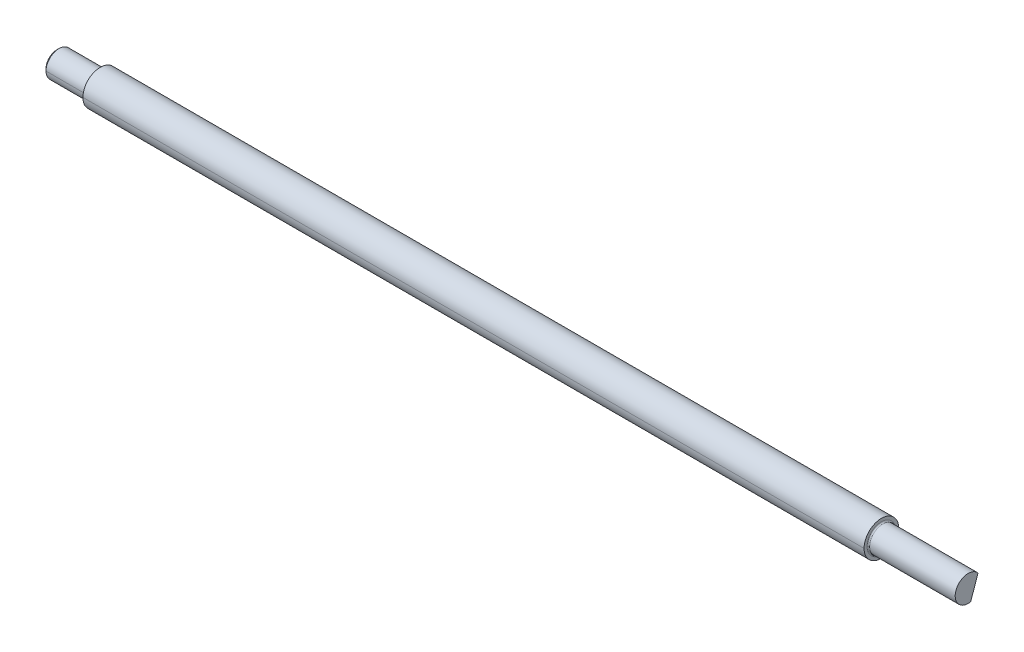
ISO-10303-21;
HEADER;
FILE_DESCRIPTION(('STEP AP214'),'2;1');
FILE_NAME('part.step','',(''),(''),'','','');
FILE_SCHEMA(('AUTOMOTIVE_DESIGN { 1 0 10303 214 1 1 1 1 }'));
ENDSEC;
DATA;
#1=APPLICATION_CONTEXT('core data for automotive mechanical design processes');
#2=APPLICATION_PROTOCOL_DEFINITION('international standard','automotive_design',2000,#1);
#3=PRODUCT_CONTEXT('',#1,'mechanical');
#4=PRODUCT('Part','Part','',(#3));
#5=PRODUCT_RELATED_PRODUCT_CATEGORY('part','',(#4));
#6=PRODUCT_DEFINITION_FORMATION('','',#4);
#7=PRODUCT_DEFINITION_CONTEXT('part definition',#1,'design');
#8=PRODUCT_DEFINITION('design','',#6,#7);
#9=PRODUCT_DEFINITION_SHAPE('','',#8);
#10=(LENGTH_UNIT() NAMED_UNIT(*) SI_UNIT(.MILLI.,.METRE.));
#11=(NAMED_UNIT(*) PLANE_ANGLE_UNIT() SI_UNIT($,.RADIAN.));
#12=(NAMED_UNIT(*) SI_UNIT($,.STERADIAN.) SOLID_ANGLE_UNIT());
#13=UNCERTAINTY_MEASURE_WITH_UNIT(LENGTH_MEASURE(1.E-05),#10,'distance_accuracy_value','');
#14=(GEOMETRIC_REPRESENTATION_CONTEXT(3) GLOBAL_UNCERTAINTY_ASSIGNED_CONTEXT((#13)) GLOBAL_UNIT_ASSIGNED_CONTEXT((#10,
#11,#12)) REPRESENTATION_CONTEXT('',''));
#15=CARTESIAN_POINT('',(0.,0.,0.));
#16=DIRECTION('',(0.,0.,1.));
#17=DIRECTION('',(1.,0.,0.));
#18=AXIS2_PLACEMENT_3D('',#15,#16,#17);
#19=CARTESIAN_POINT('',(200.,0.,0.));
#20=DIRECTION('',(-1.,0.,0.));
#21=DIRECTION('',(0.,-1.,0.));
#22=AXIS2_PLACEMENT_3D('',#19,#20,#21);
#23=CYLINDRICAL_SURFACE('',#22,3.);
#24=DIRECTION('',(1.,0.,0.));
#25=VECTOR('',#24,1.);
#26=CARTESIAN_POINT('',(202.,1.97576276272791,-2.2575122381546));
#27=LINE('',#26,#25);
#28=CARTESIAN_POINT('',(202.,1.97576276272791,-2.2575122381546));
#29=VERTEX_POINT('',#28);
#30=CARTESIAN_POINT('',(210.,1.97576276272791,-2.2575122381546));
#31=VERTEX_POINT('',#30);
#32=EDGE_CURVE('E57',#29,#31,#27,.T.);
#33=ORIENTED_EDGE('',*,*,#32,.F.);
#34=CARTESIAN_POINT('',(202.,0.,0.));
#35=DIRECTION('',(1.,0.,0.));
#36=DIRECTION('',(0.,0.,-1.));
#37=AXIS2_PLACEMENT_3D('',#34,#35,#36);
#38=CIRCLE('',#37,3.);
#39=CARTESIAN_POINT('',(202.,-2.94294432895997,-0.582304625297059));
#40=VERTEX_POINT('',#39);
#41=EDGE_CURVE('E131',#40,#29,#38,.T.);
#42=ORIENTED_EDGE('',*,*,#41,.F.);
#43=DIRECTION('',(1.,0.,0.));
#44=VECTOR('',#43,1.);
#45=CARTESIAN_POINT('',(202.,-2.94294432895997,-0.582304625297059));
#46=LINE('',#45,#44);
#47=CARTESIAN_POINT('',(210.,-2.94294432895997,-0.582304625297059));
#48=VERTEX_POINT('',#47);
#49=EDGE_CURVE('E121',#40,#48,#46,.T.);
#50=ORIENTED_EDGE('',*,*,#49,.T.);
#51=CARTESIAN_POINT('',(210.,0.,0.));
#52=DIRECTION('',(1.,0.,0.));
#53=DIRECTION('',(0.,0.,-1.));
#54=AXIS2_PLACEMENT_3D('',#51,#52,#53);
#55=CIRCLE('',#54,3.);
#56=EDGE_CURVE('E139',#31,#48,#55,.T.);
#57=ORIENTED_EDGE('',*,*,#56,.F.);
#58=EDGE_LOOP('',(#33,#42,#50,#57));
#59=FACE_BOUND('',#58,.T.);
#60=DIRECTION('',(-1.,0.,0.));
#61=VECTOR('',#60,1.);
#62=CARTESIAN_POINT('',(199.5,0.,3.));
#63=LINE('',#62,#61);
#64=CARTESIAN_POINT('',(198.,0.,3.));
#65=VERTEX_POINT('',#64);
#66=CARTESIAN_POINT('',(190.3,0.,3.));
#67=VERTEX_POINT('',#66);
#68=EDGE_CURVE('E43',#65,#67,#63,.T.);
#69=ORIENTED_EDGE('',*,*,#68,.F.);
#70=ORIENTED_EDGE('',*,*,#68,.T.);
#71=CARTESIAN_POINT('',(190.3,0.,0.));
#72=DIRECTION('',(1.,0.,0.));
#73=DIRECTION('',(0.,0.,-1.));
#74=AXIS2_PLACEMENT_3D('',#71,#72,#73);
#75=CIRCLE('',#74,3.);
#76=CARTESIAN_POINT('',(190.3,0.,-3.00000000000001));
#77=VERTEX_POINT('',#76);
#78=EDGE_CURVE('E12',#67,#77,#75,.T.);
#79=ORIENTED_EDGE('',*,*,#78,.T.);
#80=DIRECTION('',(-1.,0.,0.));
#81=VECTOR('',#80,1.);
#82=CARTESIAN_POINT('',(199.5,0.,-3.));
#83=LINE('',#82,#81);
#84=CARTESIAN_POINT('',(198.,0.,-3.));
#85=VERTEX_POINT('',#84);
#86=EDGE_CURVE('E49',#85,#77,#83,.T.);
#87=ORIENTED_EDGE('',*,*,#86,.F.);
#88=ORIENTED_EDGE('',*,*,#86,.T.);
#89=CARTESIAN_POINT('',(190.3,0.,0.));
#90=DIRECTION('',(1.,0.,0.));
#91=DIRECTION('',(0.,0.,-1.));
#92=AXIS2_PLACEMENT_3D('',#89,#90,#91);
#93=CIRCLE('',#92,3.);
#94=EDGE_CURVE('E193',#77,#67,#93,.T.);
#95=ORIENTED_EDGE('',*,*,#94,.T.);
#96=EDGE_LOOP('',(#69,#70,#79,#87,#88,#95));
#97=FACE_BOUND('',#96,.T.);
#98=ADVANCED_FACE('F40',(#59,#97),#23,.T.);
#99=CARTESIAN_POINT('',(190.299999999993,0.,0.));
#100=DIRECTION('',(1.,0.,0.));
#101=DIRECTION('',(0.,-1.,0.));
#102=AXIS2_PLACEMENT_3D('',#99,#100,#101);
#103=TOROIDAL_SURFACE('',#102,3.3,0.3);
#104=CARTESIAN_POINT('',(190.,0.,0.));
#105=DIRECTION('',(1.,0.,0.));
#106=DIRECTION('',(0.,0.,-1.));
#107=AXIS2_PLACEMENT_3D('',#104,#105,#106);
#108=CIRCLE('',#107,3.3);
#109=CARTESIAN_POINT('',(190.,0.,-3.3));
#110=VERTEX_POINT('',#109);
#111=CARTESIAN_POINT('',(189.999999999993,0.,3.3));
#112=VERTEX_POINT('',#111);
#113=EDGE_CURVE('E251',#110,#112,#108,.T.);
#114=ORIENTED_EDGE('',*,*,#113,.T.);
#115=CARTESIAN_POINT('',(190.3,0.,3.));
#116=CARTESIAN_POINT('',(190.295091256522,0.,2.99999989587325));
#117=CARTESIAN_POINT('',(190.290182521903,0.,3.00012047486223));
#118=CARTESIAN_POINT('',(190.2803768735,0.,3.000602251414));
#119=CARTESIAN_POINT('',(190.275479959714,0.,3.0009634489768));
#120=CARTESIAN_POINT('',(190.265709756087,0.,3.00192571501859));
#121=CARTESIAN_POINT('',(190.260836466246,0.,3.00252678349759));
#122=CARTESIAN_POINT('',(190.251125249079,0.,3.00396731052167));
#123=CARTESIAN_POINT('',(190.246287321752,0.,3.00480676906676));
#124=CARTESIAN_POINT('',(190.236658485036,0.,3.0067220626889));
#125=CARTESIAN_POINT('',(190.231867575647,0.,3.00779789776595));
#126=CARTESIAN_POINT('',(190.222344316409,0.,3.01018335031445));
#127=CARTESIAN_POINT('',(190.217611966561,0.,3.0114929677859));
#128=CARTESIAN_POINT('',(190.208217227083,0.,3.01434283077146));
#129=CARTESIAN_POINT('',(190.203554837453,0.,3.01588307628558));
#130=CARTESIAN_POINT('',(190.194311250508,0.,3.01919048460091));
#131=CARTESIAN_POINT('',(190.189730053192,0.,3.02095764740214));
#132=CARTESIAN_POINT('',(190.180659887384,0.,3.02471463308706));
#133=CARTESIAN_POINT('',(190.176170918891,0.,3.02670445597075));
#134=CARTESIAN_POINT('',(190.167296025046,0.,3.03090196815086));
#135=CARTESIAN_POINT('',(190.162910099693,0.,3.03310965744727));
#136=CARTESIAN_POINT('',(190.154251858206,0.,3.03773758393917));
#137=CARTESIAN_POINT('',(190.149979542072,0.,3.04015782113465));
#138=CARTESIAN_POINT('',(190.141558811406,0.,3.04520501286044));
#139=CARTESIAN_POINT('',(190.137410396874,0.,3.04783196739075));
#140=CARTESIAN_POINT('',(190.129247463307,0.,3.05328626522285));
#141=CARTESIAN_POINT('',(190.125232944272,0.,3.05611360852464));
#142=CARTESIAN_POINT('',(190.117347473025,0.,3.061961872582));
#143=CARTESIAN_POINT('',(190.113476520814,0.,3.06498279333757));
#144=CARTESIAN_POINT('',(190.10588750868,0.,3.07121093463978));
#145=CARTESIAN_POINT('',(190.102169448756,0.,3.07441815518642));
#146=CARTESIAN_POINT('',(190.094895178328,0.,3.08101116959559));
#147=CARTESIAN_POINT('',(190.091338967823,0.,3.0843969634581));
#148=CARTESIAN_POINT('',(190.084396963456,0.,3.09133896782501));
#149=CARTESIAN_POINT('',(190.081011169593,0.,3.09489517832941));
#150=CARTESIAN_POINT('',(190.074418155184,0.,3.1021694487575));
#151=CARTESIAN_POINT('',(190.071210934637,0.,3.1058875086812));
#152=CARTESIAN_POINT('',(190.064982793335,0.,3.11347652081586));
#153=CARTESIAN_POINT('',(190.061961872579,0.,3.11734747302683));
#154=CARTESIAN_POINT('',(190.056113608522,0.,3.12523294427312));
#155=CARTESIAN_POINT('',(190.05328626522,0.,3.12924746330844));
#156=CARTESIAN_POINT('',(190.047831967388,0.,3.13741039687542));
#157=CARTESIAN_POINT('',(190.045205012857,0.,3.1415588114071));
#158=CARTESIAN_POINT('',(190.040157821131,0.,3.14997954207283));
#159=CARTESIAN_POINT('',(190.037737583936,0.,3.15425185820689));
#160=CARTESIAN_POINT('',(190.033109657444,0.,3.16291009969365));
#161=CARTESIAN_POINT('',(190.030901968147,0.,3.16729602504635));
#162=CARTESIAN_POINT('',(190.026704455967,0.,3.17617091889191));
#163=CARTESIAN_POINT('',(190.024714633083,0.,3.18065988738476));
#164=CARTESIAN_POINT('',(190.020957647398,0.,3.18973005319294));
#165=CARTESIAN_POINT('',(190.019190484596,0.,3.19431125050825));
#166=CARTESIAN_POINT('',(190.015883076281,0.,3.20355483745352));
#167=CARTESIAN_POINT('',(190.014342830767,0.,3.20821722708347));
#168=CARTESIAN_POINT('',(190.011492967781,0.,3.21761196656133));
#169=CARTESIAN_POINT('',(190.010183350309,0.,3.22234431640923));
#170=CARTESIAN_POINT('',(190.007797897761,0.,3.23186757564668));
#171=CARTESIAN_POINT('',(190.006722062683,0.,3.23665848503622));
#172=CARTESIAN_POINT('',(190.004806769061,0.,3.24628732175237));
#173=CARTESIAN_POINT('',(190.003967310516,0.,3.25112524907898));
#174=CARTESIAN_POINT('',(190.002526783492,0.,3.2608364662465));
#175=CARTESIAN_POINT('',(190.001925715012,0.,3.26570975608741));
#176=CARTESIAN_POINT('',(190.00096344897,0.,3.27547995971398));
#177=CARTESIAN_POINT('',(190.000602251407,0.,3.28037687349963));
#178=CARTESIAN_POINT('',(190.000120474855,0.,3.29018252190347));
#179=CARTESIAN_POINT('',(189.999999895866,0.,3.29509125652166));
#180=CARTESIAN_POINT('',(189.999999999993,0.,3.3));
#181=B_SPLINE_CURVE_WITH_KNOTS('',3,(#115,#116,#117,#118,#119,#120,#121,#122,#123,#124,#125,
#126,#127,#128,#129,#130,#131,#132,#133,#134,#135,#136,#137,#138,#139,#140,#141,#142,#143,#144,
#145,#146,#147,#148,#149,#150,#151,#152,#153,#154,#155,#156,#157,#158,#159,#160,#161,#162,#163,
#164,#165,#166,#167,#168,#169,#170,#171,#172,#173,#174,#175,#176,#177,#178,#179,#180),
.UNSPECIFIED.,.F.,.F.,(4,2,2,2,2,2,2,2,2,2,2,2,2,2,2,2,2,2,2,2,2,2,2,2,2,2,2,2,2,2,2,2,4),(0.,
0.0147247371139736,0.0294494742279372,0.0441742113419071,0.0588989484558698,0.0736236855698409,
0.0883484226837944,0.103073159797769,0.117797896911725,0.132522634025707,0.147247371139659,
0.161972108253644,0.1766968453676,0.191421582481565,0.20614631959554,0.220871056709509,
0.235595793823459,0.250320530937427,0.265045268051405,0.279770005165375,0.294494742279338,
0.309219479393307,0.323944216507266,0.338668953621236,0.353393690735201,0.368118427849168,
0.382843164963138,0.397567902077105,0.412292639191072,0.427017376305037,0.441742113419003,
0.456466850532971,0.471191587646937),.UNSPECIFIED.);
#182=EDGE_CURVE('E255',#67,#112,#181,.T.);
#183=ORIENTED_EDGE('',*,*,#182,.F.);
#184=ORIENTED_EDGE('',*,*,#94,.F.);
#185=CARTESIAN_POINT('',(190.3,0.,-3.));
#186=CARTESIAN_POINT('',(190.295091256522,0.,-2.99999989587325));
#187=CARTESIAN_POINT('',(190.290182521903,0.,-3.00012047486223));
#188=CARTESIAN_POINT('',(190.2803768735,0.,-3.000602251414));
#189=CARTESIAN_POINT('',(190.275479959714,0.,-3.0009634489768));
#190=CARTESIAN_POINT('',(190.265709756087,0.,-3.00192571501859));
#191=CARTESIAN_POINT('',(190.260836466246,0.,-3.00252678349759));
#192=CARTESIAN_POINT('',(190.251125249079,0.,-3.00396731052167));
#193=CARTESIAN_POINT('',(190.246287321752,0.,-3.00480676906676));
#194=CARTESIAN_POINT('',(190.236658485036,0.,-3.0067220626889));
#195=CARTESIAN_POINT('',(190.231867575647,0.,-3.00779789776595));
#196=CARTESIAN_POINT('',(190.222344316409,0.,-3.01018335031445));
#197=CARTESIAN_POINT('',(190.217611966561,0.,-3.0114929677859));
#198=CARTESIAN_POINT('',(190.208217227083,0.,-3.01434283077146));
#199=CARTESIAN_POINT('',(190.203554837453,0.,-3.01588307628558));
#200=CARTESIAN_POINT('',(190.194311250508,0.,-3.01919048460091));
#201=CARTESIAN_POINT('',(190.189730053192,0.,-3.02095764740214));
#202=CARTESIAN_POINT('',(190.180659887384,0.,-3.02471463308706));
#203=CARTESIAN_POINT('',(190.176170918891,0.,-3.02670445597075));
#204=CARTESIAN_POINT('',(190.167296025046,0.,-3.03090196815086));
#205=CARTESIAN_POINT('',(190.162910099693,0.,-3.03310965744727));
#206=CARTESIAN_POINT('',(190.154251858206,0.,-3.03773758393917));
#207=CARTESIAN_POINT('',(190.149979542072,0.,-3.04015782113465));
#208=CARTESIAN_POINT('',(190.141558811406,0.,-3.04520501286044));
#209=CARTESIAN_POINT('',(190.137410396874,0.,-3.04783196739075));
#210=CARTESIAN_POINT('',(190.129247463307,0.,-3.05328626522285));
#211=CARTESIAN_POINT('',(190.125232944272,0.,-3.05611360852464));
#212=CARTESIAN_POINT('',(190.117347473025,0.,-3.061961872582));
#213=CARTESIAN_POINT('',(190.113476520814,0.,-3.06498279333757));
#214=CARTESIAN_POINT('',(190.10588750868,0.,-3.07121093463978));
#215=CARTESIAN_POINT('',(190.102169448756,0.,-3.07441815518643));
#216=CARTESIAN_POINT('',(190.094895178328,0.,-3.08101116959559));
#217=CARTESIAN_POINT('',(190.091338967823,0.,-3.0843969634581));
#218=CARTESIAN_POINT('',(190.084396963456,0.,-3.09133896782501));
#219=CARTESIAN_POINT('',(190.081011169593,0.,-3.09489517832941));
#220=CARTESIAN_POINT('',(190.074418155184,0.,-3.1021694487575));
#221=CARTESIAN_POINT('',(190.071210934637,0.,-3.1058875086812));
#222=CARTESIAN_POINT('',(190.064982793335,0.,-3.11347652081586));
#223=CARTESIAN_POINT('',(190.061961872579,0.,-3.11734747302683));
#224=CARTESIAN_POINT('',(190.056113608522,0.,-3.12523294427312));
#225=CARTESIAN_POINT('',(190.05328626522,0.,-3.12924746330844));
#226=CARTESIAN_POINT('',(190.047831967388,0.,-3.13741039687542));
#227=CARTESIAN_POINT('',(190.045205012857,0.,-3.1415588114071));
#228=CARTESIAN_POINT('',(190.040157821131,0.,-3.14997954207283));
#229=CARTESIAN_POINT('',(190.037737583936,0.,-3.15425185820689));
#230=CARTESIAN_POINT('',(190.033109657444,0.,-3.16291009969365));
#231=CARTESIAN_POINT('',(190.030901968147,0.,-3.16729602504635));
#232=CARTESIAN_POINT('',(190.026704455967,0.,-3.17617091889191));
#233=CARTESIAN_POINT('',(190.024714633083,0.,-3.18065988738477));
#234=CARTESIAN_POINT('',(190.020957647398,0.,-3.18973005319294));
#235=CARTESIAN_POINT('',(190.019190484596,0.,-3.19431125050825));
#236=CARTESIAN_POINT('',(190.015883076281,0.,-3.20355483745352));
#237=CARTESIAN_POINT('',(190.014342830767,0.,-3.20821722708347));
#238=CARTESIAN_POINT('',(190.011492967781,0.,-3.21761196656133));
#239=CARTESIAN_POINT('',(190.010183350309,0.,-3.22234431640923));
#240=CARTESIAN_POINT('',(190.007797897761,0.,-3.23186757564668));
#241=CARTESIAN_POINT('',(190.006722062683,0.,-3.23665848503622));
#242=CARTESIAN_POINT('',(190.004806769061,0.,-3.24628732175238));
#243=CARTESIAN_POINT('',(190.003967310516,0.,-3.25112524907898));
#244=CARTESIAN_POINT('',(190.002526783492,0.,-3.2608364662465));
#245=CARTESIAN_POINT('',(190.001925715012,0.,-3.26570975608741));
#246=CARTESIAN_POINT('',(190.00096344897,0.,-3.27547995971398));
#247=CARTESIAN_POINT('',(190.000602251407,0.,-3.28037687349963));
#248=CARTESIAN_POINT('',(190.000120474855,0.,-3.29018252190347));
#249=CARTESIAN_POINT('',(189.999999895866,0.,-3.29509125652166));
#250=CARTESIAN_POINT('',(189.999999999993,0.,-3.3));
#251=B_SPLINE_CURVE_WITH_KNOTS('',3,(#185,#186,#187,#188,#189,#190,#191,#192,#193,#194,#195,
#196,#197,#198,#199,#200,#201,#202,#203,#204,#205,#206,#207,#208,#209,#210,#211,#212,#213,#214,
#215,#216,#217,#218,#219,#220,#221,#222,#223,#224,#225,#226,#227,#228,#229,#230,#231,#232,#233,
#234,#235,#236,#237,#238,#239,#240,#241,#242,#243,#244,#245,#246,#247,#248,#249,#250),
.UNSPECIFIED.,.F.,.F.,(4,2,2,2,2,2,2,2,2,2,2,2,2,2,2,2,2,2,2,2,2,2,2,2,2,2,2,2,2,2,2,2,4),(0.,
0.0147247371139736,0.0294494742279372,0.0441742113419071,0.0588989484558698,0.0736236855698409,
0.0883484226837944,0.103073159797769,0.117797896911725,0.132522634025707,0.147247371139659,
0.161972108253645,0.1766968453676,0.191421582481565,0.20614631959554,0.220871056709509,
0.235595793823459,0.250320530937428,0.265045268051405,0.279770005165376,0.294494742279338,
0.309219479393307,0.323944216507267,0.338668953621237,0.353393690735201,0.368118427849168,
0.382843164963138,0.397567902077106,0.412292639191073,0.427017376305037,0.441742113419003,
0.456466850532972,0.471191587646938),.UNSPECIFIED.);
#252=EDGE_CURVE('E303',#77,#110,#251,.T.);
#253=ORIENTED_EDGE('',*,*,#252,.T.);
#254=EDGE_LOOP('',(#114,#183,#184,#253));
#255=FACE_BOUND('',#254,.T.);
#256=ADVANCED_FACE('F266',(#255),#103,.F.);
#257=CARTESIAN_POINT('',(190.299999999993,0.,0.));
#258=DIRECTION('',(1.,0.,0.));
#259=DIRECTION('',(0.,1.,0.));
#260=AXIS2_PLACEMENT_3D('',#257,#258,#259);
#261=TOROIDAL_SURFACE('',#260,3.3,0.3);
#262=ORIENTED_EDGE('',*,*,#78,.F.);
#263=ORIENTED_EDGE('',*,*,#182,.T.);
#264=CARTESIAN_POINT('',(190.,0.,0.));
#265=DIRECTION('',(1.,0.,0.));
#266=DIRECTION('',(0.,0.,-1.));
#267=AXIS2_PLACEMENT_3D('',#264,#265,#266);
#268=CIRCLE('',#267,3.3);
#269=EDGE_CURVE('E301',#112,#110,#268,.T.);
#270=ORIENTED_EDGE('',*,*,#269,.T.);
#271=ORIENTED_EDGE('',*,*,#252,.F.);
#272=EDGE_LOOP('',(#262,#263,#270,#271));
#273=FACE_BOUND('',#272,.T.);
#274=ADVANCED_FACE('F275',(#273),#261,.F.);
#275=CARTESIAN_POINT('',(190.,4.,0.));
#276=DIRECTION('',(-1.,0.,0.));
#277=DIRECTION('',(0.,0.,1.));
#278=AXIS2_PLACEMENT_3D('',#275,#276,#277);
#279=PLANE('',#278);
#280=ORIENTED_EDGE('',*,*,#113,.F.);
#281=ORIENTED_EDGE('',*,*,#269,.F.);
#282=EDGE_LOOP('',(#280,#281));
#283=FACE_BOUND('',#282,.T.);
#284=CARTESIAN_POINT('',(190.,0.,0.));
#285=DIRECTION('',(1.,0.,0.));
#286=DIRECTION('',(0.,0.,-1.));
#287=AXIS2_PLACEMENT_3D('',#284,#285,#286);
#288=CIRCLE('',#287,4.);
#289=CARTESIAN_POINT('',(190.,0.,-4.));
#290=VERTEX_POINT('',#289);
#291=CARTESIAN_POINT('',(190.,0.,4.));
#292=VERTEX_POINT('',#291);
#293=EDGE_CURVE('E304',#290,#292,#288,.T.);
#294=ORIENTED_EDGE('',*,*,#293,.T.);
#295=CARTESIAN_POINT('',(190.,0.,0.));
#296=DIRECTION('',(1.,0.,0.));
#297=DIRECTION('',(0.,0.,-1.));
#298=AXIS2_PLACEMENT_3D('',#295,#296,#297);
#299=CIRCLE('',#298,4.);
#300=EDGE_CURVE('E350',#292,#290,#299,.T.);
#301=ORIENTED_EDGE('',*,*,#300,.T.);
#302=EDGE_LOOP('',(#294,#301));
#303=FACE_BOUND('',#302,.T.);
#304=ADVANCED_FACE('F604',(#283,#303),#279,.F.);
#305=CARTESIAN_POINT('',(190.,0.,0.));
#306=DIRECTION('',(-1.,0.,0.));
#307=DIRECTION('',(0.,1.,0.));
#308=AXIS2_PLACEMENT_3D('',#305,#306,#307);
#309=CYLINDRICAL_SURFACE('',#308,4.);
#310=CARTESIAN_POINT('',(10.,0.,0.));
#311=DIRECTION('',(1.,0.,0.));
#312=DIRECTION('',(0.,0.,-1.));
#313=AXIS2_PLACEMENT_3D('',#310,#311,#312);
#314=CIRCLE('',#313,4.);
#315=CARTESIAN_POINT('',(10.,0.,4.));
#316=VERTEX_POINT('',#315);
#317=CARTESIAN_POINT('',(10.,0.,-4.));
#318=VERTEX_POINT('',#317);
#319=EDGE_CURVE('E360',#316,#318,#314,.T.);
#320=ORIENTED_EDGE('',*,*,#319,.T.);
#321=DIRECTION('',(-1.,0.,0.));
#322=VECTOR('',#321,1.);
#323=CARTESIAN_POINT('',(190.,0.,-4.));
#324=LINE('',#323,#322);
#325=EDGE_CURVE('E340',#290,#318,#324,.T.);
#326=ORIENTED_EDGE('',*,*,#325,.F.);
#327=ORIENTED_EDGE('',*,*,#300,.F.);
#328=DIRECTION('',(-1.,0.,0.));
#329=VECTOR('',#328,1.);
#330=CARTESIAN_POINT('',(190.,0.,4.));
#331=LINE('',#330,#329);
#332=EDGE_CURVE('E331',#292,#316,#331,.T.);
#333=ORIENTED_EDGE('',*,*,#332,.T.);
#334=EDGE_LOOP('',(#320,#326,#327,#333));
#335=FACE_BOUND('',#334,.T.);
#336=ADVANCED_FACE('F594',(#335),#309,.T.);
#337=CARTESIAN_POINT('',(190.,0.,0.));
#338=DIRECTION('',(-1.,0.,0.));
#339=DIRECTION('',(0.,-1.,0.));
#340=AXIS2_PLACEMENT_3D('',#337,#338,#339);
#341=CYLINDRICAL_SURFACE('',#340,4.);
#342=ORIENTED_EDGE('',*,*,#293,.F.);
#343=ORIENTED_EDGE('',*,*,#325,.T.);
#344=CARTESIAN_POINT('',(10.,0.,0.));
#345=DIRECTION('',(1.,0.,0.));
#346=DIRECTION('',(0.,0.,-1.));
#347=AXIS2_PLACEMENT_3D('',#344,#345,#346);
#348=CIRCLE('',#347,4.);
#349=EDGE_CURVE('E329',#318,#316,#348,.T.);
#350=ORIENTED_EDGE('',*,*,#349,.T.);
#351=ORIENTED_EDGE('',*,*,#332,.F.);
#352=EDGE_LOOP('',(#342,#343,#350,#351));
#353=FACE_BOUND('',#352,.T.);
#354=ADVANCED_FACE('F584',(#353),#341,.T.);
#355=CARTESIAN_POINT('',(10.,0.,0.));
#356=DIRECTION('',(1.,0.,0.));
#357=DIRECTION('',(0.,0.,-1.));
#358=AXIS2_PLACEMENT_3D('',#355,#356,#357);
#359=PLANE('',#358);
#360=ORIENTED_EDGE('',*,*,#349,.F.);
#361=ORIENTED_EDGE('',*,*,#319,.F.);
#362=EDGE_LOOP('',(#360,#361));
#363=FACE_BOUND('',#362,.T.);
#364=CARTESIAN_POINT('',(10.,0.,0.));
#365=DIRECTION('',(1.,0.,0.));
#366=DIRECTION('',(0.,0.,-1.));
#367=AXIS2_PLACEMENT_3D('',#364,#365,#366);
#368=CIRCLE('',#367,3.3);
#369=CARTESIAN_POINT('',(10.,0.,-3.3));
#370=VERTEX_POINT('',#369);
#371=CARTESIAN_POINT('',(10.0000000000001,0.,3.3));
#372=VERTEX_POINT('',#371);
#373=EDGE_CURVE('E416',#370,#372,#368,.T.);
#374=ORIENTED_EDGE('',*,*,#373,.T.);
#375=CARTESIAN_POINT('',(10.,0.,0.));
#376=DIRECTION('',(1.,0.,0.));
#377=DIRECTION('',(0.,0.,-1.));
#378=AXIS2_PLACEMENT_3D('',#375,#376,#377);
#379=CIRCLE('',#378,3.3);
#380=EDGE_CURVE('E415',#372,#370,#379,.T.);
#381=ORIENTED_EDGE('',*,*,#380,.T.);
#382=EDGE_LOOP('',(#374,#381));
#383=FACE_BOUND('',#382,.T.);
#384=ADVANCED_FACE('F394',(#363,#383),#359,.F.);
#385=CARTESIAN_POINT('',(9.70000000000012,0.,0.));
#386=DIRECTION('',(1.,0.,0.));
#387=DIRECTION('',(0.,1.,0.));
#388=AXIS2_PLACEMENT_3D('',#385,#386,#387);
#389=TOROIDAL_SURFACE('',#388,3.3,0.3);
#390=ORIENTED_EDGE('',*,*,#380,.F.);
#391=CARTESIAN_POINT('',(10.0000000000001,0.,3.3));
#392=CARTESIAN_POINT('',(10.0000001041268,0.,3.29509125652173));
#393=CARTESIAN_POINT('',(9.99987952513766,0.,3.29018252190362));
#394=CARTESIAN_POINT('',(9.99939774858568,0.,3.28037687349992));
#395=CARTESIAN_POINT('',(9.99903655102278,0.,3.27547995971434));
#396=CARTESIAN_POINT('',(9.99807428498078,0.,3.26570975608791));
#397=CARTESIAN_POINT('',(9.99747321650169,0.,3.26083646624707));
#398=CARTESIAN_POINT('',(9.99603268947742,0.,3.25112524907969));
#399=CARTESIAN_POINT('',(9.99519323093224,0.,3.24628732175315));
#400=CARTESIAN_POINT('',(9.99327793730993,0.,3.23665848503714));
#401=CARTESIAN_POINT('',(9.9922021022328,0.,3.23186757564766));
#402=CARTESIAN_POINT('',(9.98981664968415,0.,3.22234431641034));
#403=CARTESIAN_POINT('',(9.98850703221263,0.,3.2176119665625));
#404=CARTESIAN_POINT('',(9.98565716922692,0.,3.20821722708477));
#405=CARTESIAN_POINT('',(9.98411692371275,0.,3.20355483745488));
#406=CARTESIAN_POINT('',(9.98080951539729,0.,3.19431125050973));
#407=CARTESIAN_POINT('',(9.97904235259601,0.,3.18973005319448));
#408=CARTESIAN_POINT('',(9.97528536691098,0.,3.18065988738641));
#409=CARTESIAN_POINT('',(9.97329554402724,0.,3.17617091889361));
#410=CARTESIAN_POINT('',(9.96909803184704,0.,3.16729602504816));
#411=CARTESIAN_POINT('',(9.96689034255059,0.,3.1629100996955));
#412=CARTESIAN_POINT('',(9.96226241605862,0.,3.15425185820883));
#413=CARTESIAN_POINT('',(9.95984217886311,0.,3.14997954207482));
#414=CARTESIAN_POINT('',(9.95479498713726,0.,3.14155881140917));
#415=CARTESIAN_POINT('',(9.95216803260693,0.,3.13741039687754));
#416=CARTESIAN_POINT('',(9.94671373477479,0.,3.12924746331062));
#417=CARTESIAN_POINT('',(9.94388639147298,0.,3.12523294427534));
#418=CARTESIAN_POINT('',(9.93803812741559,0.,3.11734747302912));
#419=CARTESIAN_POINT('',(9.93501720666002,0.,3.11347652081817));
#420=CARTESIAN_POINT('',(9.9287890653578,0.,3.10588750868356));
#421=CARTESIAN_POINT('',(9.92558184481114,0.,3.10216944875988));
#422=CARTESIAN_POINT('',(9.91898883040199,0.,3.09489517833182));
#423=CARTESIAN_POINT('',(9.91560303653949,0.,3.09133896782744));
#424=CARTESIAN_POINT('',(9.9086610321726,0.,3.08439696346055));
#425=CARTESIAN_POINT('',(9.90510482166821,0.,3.08101116959805));
#426=CARTESIAN_POINT('',(9.89783055124015,0.,3.07441815518889));
#427=CARTESIAN_POINT('',(9.89411249131647,0.,3.07121093464225));
#428=CARTESIAN_POINT('',(9.88652347918185,0.,3.06498279334003));
#429=CARTESIAN_POINT('',(9.88265252697091,0.,3.06196187258445));
#430=CARTESIAN_POINT('',(9.87476705572468,0.,3.05611360852707));
#431=CARTESIAN_POINT('',(9.8707525366894,0.,3.05328626522526));
#432=CARTESIAN_POINT('',(9.86258960312248,0.,3.04783196739313));
#433=CARTESIAN_POINT('',(9.85844118859084,0.,3.0452050128628));
#434=CARTESIAN_POINT('',(9.85002045792519,0.,3.04015782113696));
#435=CARTESIAN_POINT('',(9.84574814179118,0.,3.03773758394144));
#436=CARTESIAN_POINT('',(9.83708990030451,0.,3.03310965744947));
#437=CARTESIAN_POINT('',(9.83270397495185,0.,3.03090196815302));
#438=CARTESIAN_POINT('',(9.8238290811064,0.,3.02670445597283));
#439=CARTESIAN_POINT('',(9.81934011261359,0.,3.02471463308909));
#440=CARTESIAN_POINT('',(9.81026994680553,0.,3.02095764740407));
#441=CARTESIAN_POINT('',(9.80568874949027,0.,3.01919048460279));
#442=CARTESIAN_POINT('',(9.79644516254512,0.,3.01588307628733));
#443=CARTESIAN_POINT('',(9.79178277291523,0.,3.01434283077316));
#444=CARTESIAN_POINT('',(9.7823880334375,0.,3.01149296778746));
#445=CARTESIAN_POINT('',(9.77765568358966,0.,3.01018335031594));
#446=CARTESIAN_POINT('',(9.76813242435234,0.,3.00779789776729));
#447=CARTESIAN_POINT('',(9.76334151496286,0.,3.00672206269016));
#448=CARTESIAN_POINT('',(9.75371267824685,0.,3.00480676906786));
#449=CARTESIAN_POINT('',(9.74887475092031,0.,3.00396731052268));
#450=CARTESIAN_POINT('',(9.73916353375293,0.,3.00252678349842));
#451=CARTESIAN_POINT('',(9.73429024391209,0.,3.00192571501933));
#452=CARTESIAN_POINT('',(9.72452004028566,0.,3.00096344897733));
#453=CARTESIAN_POINT('',(9.71962312650008,0.,3.00060225141443));
#454=CARTESIAN_POINT('',(9.70981747809638,0.,3.00012047486245));
#455=CARTESIAN_POINT('',(9.70490874347827,0.,2.99999989587337));
#456=CARTESIAN_POINT('',(9.7,0.,3.));
#457=B_SPLINE_CURVE_WITH_KNOTS('',3,(#391,#392,#393,#394,#395,#396,#397,#398,#399,#400,#401,
#402,#403,#404,#405,#406,#407,#408,#409,#410,#411,#412,#413,#414,#415,#416,#417,#418,#419,#420,
#421,#422,#423,#424,#425,#426,#427,#428,#429,#430,#431,#432,#433,#434,#435,#436,#437,#438,#439,
#440,#441,#442,#443,#444,#445,#446,#447,#448,#449,#450,#451,#452,#453,#454,#455,#456),
.UNSPECIFIED.,.F.,.F.,(4,2,2,2,2,2,2,2,2,2,2,2,2,2,2,2,2,2,2,2,2,2,2,2,2,2,2,2,2,2,2,2,4),(0.,
0.0147247371137512,0.0294494742275024,0.0441742113412533,0.0588989484550045,0.0736236855687557,
0.088348422682507,0.103073159796258,0.117797896910009,0.13252263402376,0.147247371137511,
0.161972108251262,0.176696845365013,0.191421582478764,0.206146319592516,0.220871056706268,
0.235595793820018,0.25032053093377,0.26504526804752,0.279770005161271,0.294494742275023,
0.309219479388774,0.323944216502524,0.338668953616276,0.353393690730028,0.368118427843777,
0.382843164957529,0.39756790207128,0.412292639185031,0.427017376298783,0.441742113412533,
0.456466850526284,0.471191587640035),.UNSPECIFIED.);
#458=CARTESIAN_POINT('',(9.7,0.,3.));
#459=VERTEX_POINT('',#458);
#460=EDGE_CURVE('E413',#372,#459,#457,.T.);
#461=ORIENTED_EDGE('',*,*,#460,.T.);
#462=CARTESIAN_POINT('',(9.7,0.,0.));
#463=DIRECTION('',(1.,0.,0.));
#464=DIRECTION('',(0.,0.,-1.));
#465=AXIS2_PLACEMENT_3D('',#462,#463,#464);
#466=CIRCLE('',#465,3.);
#467=CARTESIAN_POINT('',(9.7,0.,-3.));
#468=VERTEX_POINT('',#467);
#469=EDGE_CURVE('E654',#459,#468,#466,.T.);
#470=ORIENTED_EDGE('',*,*,#469,.T.);
#471=CARTESIAN_POINT('',(10.0000000000001,0.,-3.3));
#472=CARTESIAN_POINT('',(10.0000001041268,0.,-3.29509125652173));
#473=CARTESIAN_POINT('',(9.99987952513766,0.,-3.29018252190362));
#474=CARTESIAN_POINT('',(9.99939774858568,0.,-3.28037687349992));
#475=CARTESIAN_POINT('',(9.99903655102278,0.,-3.27547995971434));
#476=CARTESIAN_POINT('',(9.99807428498078,0.,-3.26570975608791));
#477=CARTESIAN_POINT('',(9.99747321650169,0.,-3.26083646624707));
#478=CARTESIAN_POINT('',(9.99603268947742,0.,-3.25112524907969));
#479=CARTESIAN_POINT('',(9.99519323093224,0.,-3.24628732175315));
#480=CARTESIAN_POINT('',(9.99327793730993,0.,-3.23665848503714));
#481=CARTESIAN_POINT('',(9.9922021022328,0.,-3.23186757564766));
#482=CARTESIAN_POINT('',(9.98981664968415,0.,-3.22234431641034));
#483=CARTESIAN_POINT('',(9.98850703221263,0.,-3.2176119665625));
#484=CARTESIAN_POINT('',(9.98565716922692,0.,-3.20821722708477));
#485=CARTESIAN_POINT('',(9.98411692371275,0.,-3.20355483745488));
#486=CARTESIAN_POINT('',(9.98080951539729,0.,-3.19431125050973));
#487=CARTESIAN_POINT('',(9.97904235259601,0.,-3.18973005319448));
#488=CARTESIAN_POINT('',(9.97528536691098,0.,-3.18065988738641));
#489=CARTESIAN_POINT('',(9.97329554402724,0.,-3.17617091889361));
#490=CARTESIAN_POINT('',(9.96909803184704,0.,-3.16729602504816));
#491=CARTESIAN_POINT('',(9.96689034255059,0.,-3.1629100996955));
#492=CARTESIAN_POINT('',(9.96226241605862,0.,-3.15425185820883));
#493=CARTESIAN_POINT('',(9.95984217886311,0.,-3.14997954207482));
#494=CARTESIAN_POINT('',(9.95479498713726,0.,-3.14155881140917));
#495=CARTESIAN_POINT('',(9.95216803260693,0.,-3.13741039687754));
#496=CARTESIAN_POINT('',(9.94671373477479,0.,-3.12924746331062));
#497=CARTESIAN_POINT('',(9.94388639147298,0.,-3.12523294427534));
#498=CARTESIAN_POINT('',(9.93803812741559,0.,-3.11734747302912));
#499=CARTESIAN_POINT('',(9.93501720666002,0.,-3.11347652081817));
#500=CARTESIAN_POINT('',(9.9287890653578,0.,-3.10588750868356));
#501=CARTESIAN_POINT('',(9.92558184481114,0.,-3.10216944875988));
#502=CARTESIAN_POINT('',(9.91898883040199,0.,-3.09489517833182));
#503=CARTESIAN_POINT('',(9.91560303653949,0.,-3.09133896782744));
#504=CARTESIAN_POINT('',(9.9086610321726,0.,-3.08439696346055));
#505=CARTESIAN_POINT('',(9.90510482166821,0.,-3.08101116959805));
#506=CARTESIAN_POINT('',(9.89783055124015,0.,-3.07441815518889));
#507=CARTESIAN_POINT('',(9.89411249131647,0.,-3.07121093464225));
#508=CARTESIAN_POINT('',(9.88652347918185,0.,-3.06498279334003));
#509=CARTESIAN_POINT('',(9.88265252697091,0.,-3.06196187258445));
#510=CARTESIAN_POINT('',(9.87476705572468,0.,-3.05611360852707));
#511=CARTESIAN_POINT('',(9.8707525366894,0.,-3.05328626522526));
#512=CARTESIAN_POINT('',(9.86258960312248,0.,-3.04783196739313));
#513=CARTESIAN_POINT('',(9.85844118859084,0.,-3.0452050128628));
#514=CARTESIAN_POINT('',(9.85002045792519,0.,-3.04015782113696));
#515=CARTESIAN_POINT('',(9.84574814179118,0.,-3.03773758394144));
#516=CARTESIAN_POINT('',(9.83708990030451,0.,-3.03310965744947));
#517=CARTESIAN_POINT('',(9.83270397495185,0.,-3.03090196815302));
#518=CARTESIAN_POINT('',(9.8238290811064,0.,-3.02670445597283));
#519=CARTESIAN_POINT('',(9.81934011261359,0.,-3.02471463308909));
#520=CARTESIAN_POINT('',(9.81026994680553,0.,-3.02095764740407));
#521=CARTESIAN_POINT('',(9.80568874949027,0.,-3.01919048460279));
#522=CARTESIAN_POINT('',(9.79644516254512,0.,-3.01588307628733));
#523=CARTESIAN_POINT('',(9.79178277291523,0.,-3.01434283077316));
#524=CARTESIAN_POINT('',(9.7823880334375,0.,-3.01149296778746));
#525=CARTESIAN_POINT('',(9.77765568358966,0.,-3.01018335031594));
#526=CARTESIAN_POINT('',(9.76813242435234,0.,-3.00779789776729));
#527=CARTESIAN_POINT('',(9.76334151496286,0.,-3.00672206269016));
#528=CARTESIAN_POINT('',(9.75371267824685,0.,-3.00480676906786));
#529=CARTESIAN_POINT('',(9.74887475092031,0.,-3.00396731052268));
#530=CARTESIAN_POINT('',(9.73916353375293,0.,-3.00252678349842));
#531=CARTESIAN_POINT('',(9.73429024391209,0.,-3.00192571501933));
#532=CARTESIAN_POINT('',(9.72452004028566,0.,-3.00096344897733));
#533=CARTESIAN_POINT('',(9.71962312650008,0.,-3.00060225141443));
#534=CARTESIAN_POINT('',(9.70981747809638,0.,-3.00012047486245));
#535=CARTESIAN_POINT('',(9.70490874347827,0.,-2.99999989587337));
#536=CARTESIAN_POINT('',(9.7,0.,-3.));
#537=B_SPLINE_CURVE_WITH_KNOTS('',3,(#471,#472,#473,#474,#475,#476,#477,#478,#479,#480,#481,
#482,#483,#484,#485,#486,#487,#488,#489,#490,#491,#492,#493,#494,#495,#496,#497,#498,#499,#500,
#501,#502,#503,#504,#505,#506,#507,#508,#509,#510,#511,#512,#513,#514,#515,#516,#517,#518,#519,
#520,#521,#522,#523,#524,#525,#526,#527,#528,#529,#530,#531,#532,#533,#534,#535,#536),
.UNSPECIFIED.,.F.,.F.,(4,2,2,2,2,2,2,2,2,2,2,2,2,2,2,2,2,2,2,2,2,2,2,2,2,2,2,2,2,2,2,2,4),(0.,
0.0147247371137512,0.0294494742275019,0.0441742113412533,0.0588989484550045,0.0736236855687557,
0.0883484226825066,0.103073159796258,0.117797896910009,0.13252263402376,0.147247371137511,
0.161972108251262,0.176696845365013,0.191421582478764,0.206146319592516,0.220871056706268,
0.235595793820018,0.25032053093377,0.26504526804752,0.279770005161272,0.294494742275023,
0.309219479388774,0.323944216502524,0.338668953616276,0.353393690730028,0.368118427843777,
0.382843164957529,0.39756790207128,0.412292639185031,0.427017376298783,0.441742113412533,
0.456466850526286,0.471191587640037),.UNSPECIFIED.);
#538=EDGE_CURVE('E652',#370,#468,#537,.T.);
#539=ORIENTED_EDGE('',*,*,#538,.F.);
#540=EDGE_LOOP('',(#390,#461,#470,#539));
#541=FACE_BOUND('',#540,.T.);
#542=ADVANCED_FACE('F383',(#541),#389,.F.);
#543=CARTESIAN_POINT('',(9.70000000000012,0.,0.));
#544=DIRECTION('',(1.,0.,0.));
#545=DIRECTION('',(0.,-1.,0.));
#546=AXIS2_PLACEMENT_3D('',#543,#544,#545);
#547=TOROIDAL_SURFACE('',#546,3.3,0.3);
#548=CARTESIAN_POINT('',(9.7,0.,0.));
#549=DIRECTION('',(1.,0.,0.));
#550=DIRECTION('',(0.,0.,-1.));
#551=AXIS2_PLACEMENT_3D('',#548,#549,#550);
#552=CIRCLE('',#551,3.);
#553=EDGE_CURVE('E373',#468,#459,#552,.T.);
#554=ORIENTED_EDGE('',*,*,#553,.T.);
#555=ORIENTED_EDGE('',*,*,#460,.F.);
#556=ORIENTED_EDGE('',*,*,#373,.F.);
#557=ORIENTED_EDGE('',*,*,#538,.T.);
#558=EDGE_LOOP('',(#554,#555,#556,#557));
#559=FACE_BOUND('',#558,.T.);
#560=ADVANCED_FACE('F393',(#559),#547,.F.);
#561=CARTESIAN_POINT('',(10.,0.,0.));
#562=DIRECTION('',(-1.,0.,0.));
#563=DIRECTION('',(0.,-1.,0.));
#564=AXIS2_PLACEMENT_3D('',#561,#562,#563);
#565=CYLINDRICAL_SURFACE('',#564,3.);
#566=ORIENTED_EDGE('',*,*,#553,.F.);
#567=DIRECTION('',(-1.,0.,0.));
#568=VECTOR('',#567,1.);
#569=CARTESIAN_POINT('',(9.7,0.,-3.));
#570=LINE('',#569,#568);
#571=CARTESIAN_POINT('',(0.5,0.,-3.));
#572=VERTEX_POINT('',#571);
#573=EDGE_CURVE('E241',#468,#572,#570,.T.);
#574=ORIENTED_EDGE('',*,*,#573,.T.);
#575=CARTESIAN_POINT('',(0.5,0.,0.));
#576=DIRECTION('',(1.,0.,0.));
#577=DIRECTION('',(0.,0.,-1.));
#578=AXIS2_PLACEMENT_3D('',#575,#576,#577);
#579=CIRCLE('',#578,3.);
#580=CARTESIAN_POINT('',(0.5,0.,3.));
#581=VERTEX_POINT('',#580);
#582=EDGE_CURVE('E239',#572,#581,#579,.T.);
#583=ORIENTED_EDGE('',*,*,#582,.T.);
#584=DIRECTION('',(-1.,0.,0.));
#585=VECTOR('',#584,1.);
#586=CARTESIAN_POINT('',(9.7,0.,3.));
#587=LINE('',#586,#585);
#588=EDGE_CURVE('E444',#459,#581,#587,.T.);
#589=ORIENTED_EDGE('',*,*,#588,.F.);
#590=EDGE_LOOP('',(#566,#574,#583,#589));
#591=FACE_BOUND('',#590,.T.);
#592=ADVANCED_FACE('F476',(#591),#565,.T.);
#593=CARTESIAN_POINT('',(10.,0.,0.));
#594=DIRECTION('',(-1.,0.,0.));
#595=DIRECTION('',(0.,1.,0.));
#596=AXIS2_PLACEMENT_3D('',#593,#594,#595);
#597=CYLINDRICAL_SURFACE('',#596,3.);
#598=CARTESIAN_POINT('',(0.5,0.,0.));
#599=DIRECTION('',(1.,0.,0.));
#600=DIRECTION('',(0.,0.,-1.));
#601=AXIS2_PLACEMENT_3D('',#598,#599,#600);
#602=CIRCLE('',#601,3.);
#603=EDGE_CURVE('E221',#581,#572,#602,.T.);
#604=ORIENTED_EDGE('',*,*,#603,.T.);
#605=ORIENTED_EDGE('',*,*,#573,.F.);
#606=ORIENTED_EDGE('',*,*,#469,.F.);
#607=ORIENTED_EDGE('',*,*,#588,.T.);
#608=EDGE_LOOP('',(#604,#605,#606,#607));
#609=FACE_BOUND('',#608,.T.);
#610=ADVANCED_FACE('F468',(#609),#597,.T.);
#611=CARTESIAN_POINT('',(0.,0.,0.));
#612=DIRECTION('',(1.,0.,0.));
#613=DIRECTION('',(0.,1.,0.));
#614=AXIS2_PLACEMENT_3D('',#611,#612,#613);
#615=CONICAL_SURFACE('',#614,2.5,0.7853981634);
#616=CARTESIAN_POINT('',(0.,0.,0.));
#617=DIRECTION('',(1.,0.,0.));
#618=DIRECTION('',(0.,0.,-1.));
#619=AXIS2_PLACEMENT_3D('',#616,#617,#618);
#620=CIRCLE('',#619,2.5);
#621=CARTESIAN_POINT('',(0.,0.,2.5));
#622=VERTEX_POINT('',#621);
#623=CARTESIAN_POINT('',(0.,0.,-2.5));
#624=VERTEX_POINT('',#623);
#625=EDGE_CURVE('E219',#622,#624,#620,.T.);
#626=ORIENTED_EDGE('',*,*,#625,.T.);
#627=DIRECTION('',(0.707106781184744,0.,-0.707106781188351));
#628=VECTOR('',#627,1.);
#629=CARTESIAN_POINT('',(0.,0.,-2.5));
#630=LINE('',#629,#628);
#631=EDGE_CURVE('E426',#624,#572,#630,.T.);
#632=ORIENTED_EDGE('',*,*,#631,.T.);
#633=ORIENTED_EDGE('',*,*,#603,.F.);
#634=DIRECTION('',(0.707106781184744,0.,0.707106781188352));
#635=VECTOR('',#634,1.);
#636=CARTESIAN_POINT('',(0.,0.,2.5));
#637=LINE('',#636,#635);
#638=EDGE_CURVE('E145',#622,#581,#637,.T.);
#639=ORIENTED_EDGE('',*,*,#638,.F.);
#640=EDGE_LOOP('',(#626,#632,#633,#639));
#641=FACE_BOUND('',#640,.T.);
#642=ADVANCED_FACE('F466',(#641),#615,.T.);
#643=CARTESIAN_POINT('',(0.,0.,0.));
#644=DIRECTION('',(1.,0.,0.));
#645=DIRECTION('',(0.,-1.,0.));
#646=AXIS2_PLACEMENT_3D('',#643,#644,#645);
#647=CONICAL_SURFACE('',#646,2.5,0.7853981634);
#648=ORIENTED_EDGE('',*,*,#582,.F.);
#649=ORIENTED_EDGE('',*,*,#631,.F.);
#650=CARTESIAN_POINT('',(0.,0.,0.));
#651=DIRECTION('',(1.,0.,0.));
#652=DIRECTION('',(0.,0.,-1.));
#653=AXIS2_PLACEMENT_3D('',#650,#651,#652);
#654=CIRCLE('',#653,2.5);
#655=EDGE_CURVE('E142',#624,#622,#654,.T.);
#656=ORIENTED_EDGE('',*,*,#655,.T.);
#657=ORIENTED_EDGE('',*,*,#638,.T.);
#658=EDGE_LOOP('',(#648,#649,#656,#657));
#659=FACE_BOUND('',#658,.T.);
#660=ADVANCED_FACE('F464',(#659),#647,.T.);
#661=CARTESIAN_POINT('',(0.,0.,0.));
#662=DIRECTION('',(1.,0.,0.));
#663=DIRECTION('',(0.,0.,-1.));
#664=AXIS2_PLACEMENT_3D('',#661,#662,#663);
#665=PLANE('',#664);
#666=ORIENTED_EDGE('',*,*,#655,.F.);
#667=ORIENTED_EDGE('',*,*,#625,.F.);
#668=EDGE_LOOP('',(#666,#667));
#669=FACE_BOUND('',#668,.T.);
#670=ADVANCED_FACE('F474',(#669),#665,.F.);
#671=CARTESIAN_POINT('',(210.,0.,0.));
#672=DIRECTION('',(1.,0.,0.));
#673=DIRECTION('',(0.,0.,-1.));
#674=AXIS2_PLACEMENT_3D('',#671,#672,#673);
#675=PLANE('',#674);
#676=DIRECTION('',(0.,-0.946605621150368,0.322393855410625));
#677=VECTOR('',#676,1.);
#678=CARTESIAN_POINT('',(210.,-1.73583231472667,-0.993421448909648));
#679=LINE('',#678,#677);
#680=EDGE_CURVE('E126',#31,#48,#679,.T.);
#681=ORIENTED_EDGE('',*,*,#680,.F.);
#682=ORIENTED_EDGE('',*,*,#56,.T.);
#683=EDGE_LOOP('',(#681,#682));
#684=FACE_BOUND('',#683,.T.);
#685=ADVANCED_FACE('F489',(#684),#675,.T.);
#686=CARTESIAN_POINT('',(202.,-1.73583231472667,-0.993421448909648));
#687=DIRECTION('',(0.,0.322393855410625,0.946605621150368));
#688=DIRECTION('',(0.,-0.946605621150368,0.322393855410625));
#689=AXIS2_PLACEMENT_3D('',#686,#687,#688);
#690=PLANE('',#689);
#691=ORIENTED_EDGE('',*,*,#680,.T.);
#692=ORIENTED_EDGE('',*,*,#49,.F.);
#693=DIRECTION('',(0.,-0.946605621150367,0.322393855410625));
#694=VECTOR('',#693,1.);
#695=CARTESIAN_POINT('',(202.,-1.73583231472667,-0.993421448909648));
#696=LINE('',#695,#694);
#697=EDGE_CURVE('E124',#29,#40,#696,.T.);
#698=ORIENTED_EDGE('',*,*,#697,.F.);
#699=ORIENTED_EDGE('',*,*,#32,.T.);
#700=EDGE_LOOP('',(#691,#692,#698,#699));
#701=FACE_BOUND('',#700,.T.);
#702=ADVANCED_FACE('F123',(#701),#690,.F.);
#703=CARTESIAN_POINT('',(202.,0.,0.));
#704=DIRECTION('',(1.,0.,0.));
#705=DIRECTION('',(0.,0.,-1.));
#706=AXIS2_PLACEMENT_3D('',#703,#704,#705);
#707=PLANE('',#706);
#708=ORIENTED_EDGE('',*,*,#697,.T.);
#709=ORIENTED_EDGE('',*,*,#41,.T.);
#710=EDGE_LOOP('',(#708,#709));
#711=FACE_BOUND('',#710,.T.);
#712=ADVANCED_FACE('F134',(#711),#707,.T.);
#713=CLOSED_SHELL('',(#98,#256,#274,#304,#336,#354,#384,#542,#560,#592,#610,#642,#660,#670,#685,
#702,#712));
#714=MANIFOLD_SOLID_BREP('B2',#713);
#715=ADVANCED_BREP_SHAPE_REPRESENTATION('',(#18,#714),#14);
#716=SHAPE_DEFINITION_REPRESENTATION(#9,#715);
ENDSEC;
END-ISO-10303-21;
